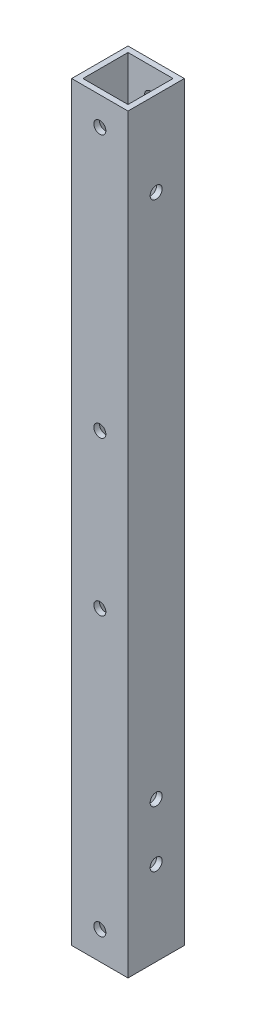
ISO-10303-21;
HEADER;
FILE_DESCRIPTION(('STEP AP214'),'2;1');
FILE_NAME('part.step','',(''),(''),'','','');
FILE_SCHEMA(('AUTOMOTIVE_DESIGN { 1 0 10303 214 1 1 1 1 }'));
ENDSEC;
DATA;
#1=APPLICATION_CONTEXT('core data for automotive mechanical design processes');
#2=APPLICATION_PROTOCOL_DEFINITION('international standard','automotive_design',2000,#1);
#3=PRODUCT_CONTEXT('',#1,'mechanical');
#4=PRODUCT('Part','Part','',(#3));
#5=PRODUCT_RELATED_PRODUCT_CATEGORY('part','',(#4));
#6=PRODUCT_DEFINITION_FORMATION('','',#4);
#7=PRODUCT_DEFINITION_CONTEXT('part definition',#1,'design');
#8=PRODUCT_DEFINITION('design','',#6,#7);
#9=PRODUCT_DEFINITION_SHAPE('','',#8);
#10=(LENGTH_UNIT() NAMED_UNIT(*) SI_UNIT(.MILLI.,.METRE.));
#11=(NAMED_UNIT(*) PLANE_ANGLE_UNIT() SI_UNIT($,.RADIAN.));
#12=(NAMED_UNIT(*) SI_UNIT($,.STERADIAN.) SOLID_ANGLE_UNIT());
#13=UNCERTAINTY_MEASURE_WITH_UNIT(LENGTH_MEASURE(1.E-05),#10,'distance_accuracy_value','');
#14=(GEOMETRIC_REPRESENTATION_CONTEXT(3) GLOBAL_UNCERTAINTY_ASSIGNED_CONTEXT((#13)) GLOBAL_UNIT_ASSIGNED_CONTEXT((#10,
#11,#12)) REPRESENTATION_CONTEXT('',''));
#15=CARTESIAN_POINT('',(0.,0.,0.));
#16=DIRECTION('',(0.,0.,1.));
#17=DIRECTION('',(1.,0.,0.));
#18=AXIS2_PLACEMENT_3D('',#15,#16,#17);
#19=CARTESIAN_POINT('',(0.,200.,0.));
#20=DIRECTION('',(0.,1.,0.));
#21=DIRECTION('',(0.,0.,1.));
#22=AXIS2_PLACEMENT_3D('',#19,#20,#21);
#23=PLANE('',#22);
#24=DIRECTION('',(0.,0.,-1.));
#25=VECTOR('',#24,1.);
#26=CARTESIAN_POINT('',(7.5,200.,-7.5));
#27=LINE('',#26,#25);
#28=CARTESIAN_POINT('',(7.5,200.,7.5));
#29=VERTEX_POINT('',#28);
#30=CARTESIAN_POINT('',(7.5,200.,-7.5));
#31=VERTEX_POINT('',#30);
#32=EDGE_CURVE('E156',#29,#31,#27,.T.);
#33=ORIENTED_EDGE('',*,*,#32,.T.);
#34=DIRECTION('',(-1.,0.,0.));
#35=VECTOR('',#34,1.);
#36=CARTESIAN_POINT('',(-7.5,200.,-7.5));
#37=LINE('',#36,#35);
#38=CARTESIAN_POINT('',(-7.5,200.,-7.5));
#39=VERTEX_POINT('',#38);
#40=EDGE_CURVE('E160',#31,#39,#37,.T.);
#41=ORIENTED_EDGE('',*,*,#40,.T.);
#42=DIRECTION('',(0.,0.,1.));
#43=VECTOR('',#42,1.);
#44=CARTESIAN_POINT('',(-7.5,200.,-7.5));
#45=LINE('',#44,#43);
#46=CARTESIAN_POINT('',(-7.5,200.,7.5));
#47=VERTEX_POINT('',#46);
#48=EDGE_CURVE('E164',#39,#47,#45,.T.);
#49=ORIENTED_EDGE('',*,*,#48,.T.);
#50=DIRECTION('',(1.,0.,0.));
#51=VECTOR('',#50,1.);
#52=CARTESIAN_POINT('',(-7.5,200.,7.5));
#53=LINE('',#52,#51);
#54=EDGE_CURVE('E167',#47,#29,#53,.T.);
#55=ORIENTED_EDGE('',*,*,#54,.T.);
#56=EDGE_LOOP('',(#33,#41,#49,#55));
#57=FACE_BOUND('',#56,.T.);
#58=DIRECTION('',(1.,0.,0.));
#59=VECTOR('',#58,1.);
#60=CARTESIAN_POINT('',(-6.,200.,6.));
#61=LINE('',#60,#59);
#62=CARTESIAN_POINT('',(-6.,200.,6.));
#63=VERTEX_POINT('',#62);
#64=CARTESIAN_POINT('',(6.,200.,6.));
#65=VERTEX_POINT('',#64);
#66=EDGE_CURVE('E115',#63,#65,#61,.T.);
#67=ORIENTED_EDGE('',*,*,#66,.F.);
#68=DIRECTION('',(0.,0.,1.));
#69=VECTOR('',#68,1.);
#70=CARTESIAN_POINT('',(-6.,200.,-6.));
#71=LINE('',#70,#69);
#72=CARTESIAN_POINT('',(-6.,200.,-6.));
#73=VERTEX_POINT('',#72);
#74=EDGE_CURVE('E106',#73,#63,#71,.T.);
#75=ORIENTED_EDGE('',*,*,#74,.F.);
#76=DIRECTION('',(-1.,0.,0.));
#77=VECTOR('',#76,1.);
#78=CARTESIAN_POINT('',(-6.,200.,-6.));
#79=LINE('',#78,#77);
#80=CARTESIAN_POINT('',(6.,200.,-6.));
#81=VERTEX_POINT('',#80);
#82=EDGE_CURVE('E132',#81,#73,#79,.T.);
#83=ORIENTED_EDGE('',*,*,#82,.F.);
#84=DIRECTION('',(0.,0.,-1.));
#85=VECTOR('',#84,1.);
#86=CARTESIAN_POINT('',(6.,200.,-6.));
#87=LINE('',#86,#85);
#88=EDGE_CURVE('E128',#65,#81,#87,.T.);
#89=ORIENTED_EDGE('',*,*,#88,.F.);
#90=EDGE_LOOP('',(#67,#75,#83,#89));
#91=FACE_BOUND('',#90,.T.);
#92=ADVANCED_FACE('F38',(#57,#91),#23,.T.);
#93=CARTESIAN_POINT('',(0.,0.,0.));
#94=DIRECTION('',(0.,1.,0.));
#95=DIRECTION('',(0.,0.,1.));
#96=AXIS2_PLACEMENT_3D('',#93,#94,#95);
#97=PLANE('',#96);
#98=DIRECTION('',(0.,0.,-1.));
#99=VECTOR('',#98,1.);
#100=CARTESIAN_POINT('',(7.5,0.,-7.5));
#101=LINE('',#100,#99);
#102=CARTESIAN_POINT('',(7.5,0.,7.5));
#103=VERTEX_POINT('',#102);
#104=CARTESIAN_POINT('',(7.5,0.,-7.5));
#105=VERTEX_POINT('',#104);
#106=EDGE_CURVE('E124',#103,#105,#101,.T.);
#107=ORIENTED_EDGE('',*,*,#106,.F.);
#108=DIRECTION('',(1.,0.,0.));
#109=VECTOR('',#108,1.);
#110=CARTESIAN_POINT('',(-7.5,0.,7.5));
#111=LINE('',#110,#109);
#112=CARTESIAN_POINT('',(-7.5,0.,7.5));
#113=VERTEX_POINT('',#112);
#114=EDGE_CURVE('E161',#113,#103,#111,.T.);
#115=ORIENTED_EDGE('',*,*,#114,.F.);
#116=DIRECTION('',(0.,0.,1.));
#117=VECTOR('',#116,1.);
#118=CARTESIAN_POINT('',(-7.5,0.,-7.5));
#119=LINE('',#118,#117);
#120=CARTESIAN_POINT('',(-7.5,0.,-7.5));
#121=VERTEX_POINT('',#120);
#122=EDGE_CURVE('E177',#121,#113,#119,.T.);
#123=ORIENTED_EDGE('',*,*,#122,.F.);
#124=DIRECTION('',(-1.,0.,0.));
#125=VECTOR('',#124,1.);
#126=CARTESIAN_POINT('',(-7.5,0.,-7.5));
#127=LINE('',#126,#125);
#128=EDGE_CURVE('E174',#105,#121,#127,.T.);
#129=ORIENTED_EDGE('',*,*,#128,.F.);
#130=EDGE_LOOP('',(#107,#115,#123,#129));
#131=FACE_BOUND('',#130,.T.);
#132=DIRECTION('',(0.,0.,1.));
#133=VECTOR('',#132,1.);
#134=CARTESIAN_POINT('',(-6.,0.,-6.));
#135=LINE('',#134,#133);
#136=CARTESIAN_POINT('',(-6.,0.,-6.));
#137=VERTEX_POINT('',#136);
#138=CARTESIAN_POINT('',(-6.,0.,6.));
#139=VERTEX_POINT('',#138);
#140=EDGE_CURVE('E64',#137,#139,#135,.T.);
#141=ORIENTED_EDGE('',*,*,#140,.T.);
#142=DIRECTION('',(1.,0.,0.));
#143=VECTOR('',#142,1.);
#144=CARTESIAN_POINT('',(-6.,0.,6.));
#145=LINE('',#144,#143);
#146=CARTESIAN_POINT('',(6.,0.,6.));
#147=VERTEX_POINT('',#146);
#148=EDGE_CURVE('E122',#139,#147,#145,.T.);
#149=ORIENTED_EDGE('',*,*,#148,.T.);
#150=DIRECTION('',(0.,0.,-1.));
#151=VECTOR('',#150,1.);
#152=CARTESIAN_POINT('',(6.,0.,-6.));
#153=LINE('',#152,#151);
#154=CARTESIAN_POINT('',(6.,0.,-6.));
#155=VERTEX_POINT('',#154);
#156=EDGE_CURVE('E143',#147,#155,#153,.T.);
#157=ORIENTED_EDGE('',*,*,#156,.T.);
#158=DIRECTION('',(-1.,0.,0.));
#159=VECTOR('',#158,1.);
#160=CARTESIAN_POINT('',(-6.,0.,-6.));
#161=LINE('',#160,#159);
#162=EDGE_CURVE('E116',#155,#137,#161,.T.);
#163=ORIENTED_EDGE('',*,*,#162,.T.);
#164=EDGE_LOOP('',(#141,#149,#157,#163));
#165=FACE_BOUND('',#164,.T.);
#166=ADVANCED_FACE('F320',(#131,#165),#97,.F.);
#167=CARTESIAN_POINT('',(7.5,200.,-7.5));
#168=DIRECTION('',(-1.,0.,0.));
#169=DIRECTION('',(0.,0.,1.));
#170=AXIS2_PLACEMENT_3D('',#167,#168,#169);
#171=PLANE('',#170);
#172=CARTESIAN_POINT('',(7.5,177.5,0.));
#173=DIRECTION('',(1.,0.,0.));
#174=DIRECTION('',(0.,0.,-1.));
#175=AXIS2_PLACEMENT_3D('',#172,#173,#174);
#176=CIRCLE('',#175,1.59999999999999);
#177=CARTESIAN_POINT('',(7.5,177.5,-1.59999999999999));
#178=VERTEX_POINT('',#177);
#179=EDGE_CURVE('E397',#178,#178,#176,.T.);
#180=ORIENTED_EDGE('',*,*,#179,.F.);
#181=EDGE_LOOP('',(#180));
#182=FACE_BOUND('',#181,.T.);
#183=CARTESIAN_POINT('',(7.5,22.5,0.));
#184=DIRECTION('',(1.,0.,0.));
#185=DIRECTION('',(0.,0.,-1.));
#186=AXIS2_PLACEMENT_3D('',#183,#184,#185);
#187=CIRCLE('',#186,1.6);
#188=CARTESIAN_POINT('',(7.5,22.5,-1.6));
#189=VERTEX_POINT('',#188);
#190=EDGE_CURVE('E407',#189,#189,#187,.T.);
#191=ORIENTED_EDGE('',*,*,#190,.F.);
#192=EDGE_LOOP('',(#191));
#193=FACE_BOUND('',#192,.T.);
#194=CARTESIAN_POINT('',(7.5,37.5,0.));
#195=DIRECTION('',(1.,0.,0.));
#196=DIRECTION('',(0.,0.,-1.));
#197=AXIS2_PLACEMENT_3D('',#194,#195,#196);
#198=CIRCLE('',#197,1.6);
#199=CARTESIAN_POINT('',(7.5,37.5,-1.6));
#200=VERTEX_POINT('',#199);
#201=EDGE_CURVE('E232',#200,#200,#198,.T.);
#202=ORIENTED_EDGE('',*,*,#201,.F.);
#203=EDGE_LOOP('',(#202));
#204=FACE_BOUND('',#203,.T.);
#205=ORIENTED_EDGE('',*,*,#106,.T.);
#206=DIRECTION('',(0.,-1.,0.));
#207=VECTOR('',#206,1.);
#208=CARTESIAN_POINT('',(7.5,200.,-7.5));
#209=LINE('',#208,#207);
#210=EDGE_CURVE('E11',#31,#105,#209,.T.);
#211=ORIENTED_EDGE('',*,*,#210,.F.);
#212=ORIENTED_EDGE('',*,*,#32,.F.);
#213=DIRECTION('',(0.,-1.,0.));
#214=VECTOR('',#213,1.);
#215=CARTESIAN_POINT('',(7.5,200.,7.5));
#216=LINE('',#215,#214);
#217=EDGE_CURVE('E170',#29,#103,#216,.T.);
#218=ORIENTED_EDGE('',*,*,#217,.T.);
#219=EDGE_LOOP('',(#205,#211,#212,#218));
#220=FACE_BOUND('',#219,.T.);
#221=ADVANCED_FACE('F40',(#182,#193,#204,#220),#171,.F.);
#222=CARTESIAN_POINT('',(-7.5,200.,-7.5));
#223=DIRECTION('',(0.,0.,1.));
#224=DIRECTION('',(1.,0.,0.));
#225=AXIS2_PLACEMENT_3D('',#222,#223,#224);
#226=PLANE('',#225);
#227=CARTESIAN_POINT('',(0.,192.5,-7.5));
#228=DIRECTION('',(0.,0.,1.));
#229=DIRECTION('',(1.,0.,0.));
#230=AXIS2_PLACEMENT_3D('',#227,#228,#229);
#231=CIRCLE('',#230,1.59999999999999);
#232=CARTESIAN_POINT('',(1.59999999999999,192.5,-7.5));
#233=VERTEX_POINT('',#232);
#234=EDGE_CURVE('E197',#233,#233,#231,.T.);
#235=ORIENTED_EDGE('',*,*,#234,.T.);
#236=EDGE_LOOP('',(#235));
#237=FACE_BOUND('',#236,.T.);
#238=CARTESIAN_POINT('',(0.,81.5,-7.5));
#239=DIRECTION('',(0.,0.,1.));
#240=DIRECTION('',(1.,0.,0.));
#241=AXIS2_PLACEMENT_3D('',#238,#239,#240);
#242=CIRCLE('',#241,1.6);
#243=CARTESIAN_POINT('',(1.6,81.5,-7.5));
#244=VERTEX_POINT('',#243);
#245=EDGE_CURVE('E248',#244,#244,#242,.T.);
#246=ORIENTED_EDGE('',*,*,#245,.T.);
#247=EDGE_LOOP('',(#246));
#248=FACE_BOUND('',#247,.T.);
#249=CARTESIAN_POINT('',(0.,122.5,-7.5));
#250=DIRECTION('',(0.,0.,1.));
#251=DIRECTION('',(1.,0.,0.));
#252=AXIS2_PLACEMENT_3D('',#249,#250,#251);
#253=CIRCLE('',#252,1.6);
#254=CARTESIAN_POINT('',(1.6,122.5,-7.5));
#255=VERTEX_POINT('',#254);
#256=EDGE_CURVE('E263',#255,#255,#253,.T.);
#257=ORIENTED_EDGE('',*,*,#256,.T.);
#258=EDGE_LOOP('',(#257));
#259=FACE_BOUND('',#258,.T.);
#260=CARTESIAN_POINT('',(0.,7.5,-7.5));
#261=DIRECTION('',(0.,0.,1.));
#262=DIRECTION('',(1.,0.,0.));
#263=AXIS2_PLACEMENT_3D('',#260,#261,#262);
#264=CIRCLE('',#263,1.6);
#265=CARTESIAN_POINT('',(1.6,7.5,-7.5));
#266=VERTEX_POINT('',#265);
#267=EDGE_CURVE('E247',#266,#266,#264,.T.);
#268=ORIENTED_EDGE('',*,*,#267,.T.);
#269=EDGE_LOOP('',(#268));
#270=FACE_BOUND('',#269,.T.);
#271=ORIENTED_EDGE('',*,*,#128,.T.);
#272=DIRECTION('',(0.,-1.,0.));
#273=VECTOR('',#272,1.);
#274=CARTESIAN_POINT('',(-7.5,200.,-7.5));
#275=LINE('',#274,#273);
#276=EDGE_CURVE('E48',#39,#121,#275,.T.);
#277=ORIENTED_EDGE('',*,*,#276,.F.);
#278=ORIENTED_EDGE('',*,*,#40,.F.);
#279=ORIENTED_EDGE('',*,*,#210,.T.);
#280=EDGE_LOOP('',(#271,#277,#278,#279));
#281=FACE_BOUND('',#280,.T.);
#282=ADVANCED_FACE('F324',(#237,#248,#259,#270,#281),#226,.F.);
#283=CARTESIAN_POINT('',(-7.5,200.,-7.5));
#284=DIRECTION('',(1.,0.,0.));
#285=DIRECTION('',(0.,0.,-1.));
#286=AXIS2_PLACEMENT_3D('',#283,#284,#285);
#287=PLANE('',#286);
#288=CARTESIAN_POINT('',(-7.5,177.5,0.));
#289=DIRECTION('',(1.,0.,0.));
#290=DIRECTION('',(0.,0.,-1.));
#291=AXIS2_PLACEMENT_3D('',#288,#289,#290);
#292=CIRCLE('',#291,1.59999999999999);
#293=CARTESIAN_POINT('',(-7.5,177.5,-1.59999999999999));
#294=VERTEX_POINT('',#293);
#295=EDGE_CURVE('E216',#294,#294,#292,.T.);
#296=ORIENTED_EDGE('',*,*,#295,.T.);
#297=EDGE_LOOP('',(#296));
#298=FACE_BOUND('',#297,.T.);
#299=CARTESIAN_POINT('',(-7.5,22.5,0.));
#300=DIRECTION('',(1.,0.,0.));
#301=DIRECTION('',(0.,0.,-1.));
#302=AXIS2_PLACEMENT_3D('',#299,#300,#301);
#303=CIRCLE('',#302,1.6);
#304=CARTESIAN_POINT('',(-7.5,22.5,-1.6));
#305=VERTEX_POINT('',#304);
#306=EDGE_CURVE('E401',#305,#305,#303,.T.);
#307=ORIENTED_EDGE('',*,*,#306,.T.);
#308=EDGE_LOOP('',(#307));
#309=FACE_BOUND('',#308,.T.);
#310=CARTESIAN_POINT('',(-7.5,37.5,0.));
#311=DIRECTION('',(1.,0.,0.));
#312=DIRECTION('',(0.,0.,-1.));
#313=AXIS2_PLACEMENT_3D('',#310,#311,#312);
#314=CIRCLE('',#313,1.6);
#315=CARTESIAN_POINT('',(-7.5,37.5,-1.6));
#316=VERTEX_POINT('',#315);
#317=EDGE_CURVE('E410',#316,#316,#314,.T.);
#318=ORIENTED_EDGE('',*,*,#317,.T.);
#319=EDGE_LOOP('',(#318));
#320=FACE_BOUND('',#319,.T.);
#321=ORIENTED_EDGE('',*,*,#122,.T.);
#322=DIRECTION('',(0.,-1.,0.));
#323=VECTOR('',#322,1.);
#324=CARTESIAN_POINT('',(-7.5,200.,7.5));
#325=LINE('',#324,#323);
#326=EDGE_CURVE('E185',#47,#113,#325,.T.);
#327=ORIENTED_EDGE('',*,*,#326,.F.);
#328=ORIENTED_EDGE('',*,*,#48,.F.);
#329=ORIENTED_EDGE('',*,*,#276,.T.);
#330=EDGE_LOOP('',(#321,#327,#328,#329));
#331=FACE_BOUND('',#330,.T.);
#332=ADVANCED_FACE('F307',(#298,#309,#320,#331),#287,.F.);
#333=CARTESIAN_POINT('',(-7.5,200.,7.5));
#334=DIRECTION('',(0.,0.,-1.));
#335=DIRECTION('',(-1.,0.,0.));
#336=AXIS2_PLACEMENT_3D('',#333,#334,#335);
#337=PLANE('',#336);
#338=CARTESIAN_POINT('',(0.,192.5,7.5));
#339=DIRECTION('',(0.,0.,1.));
#340=DIRECTION('',(1.,0.,0.));
#341=AXIS2_PLACEMENT_3D('',#338,#339,#340);
#342=CIRCLE('',#341,1.59999999999999);
#343=CARTESIAN_POINT('',(1.59999999999999,192.5,7.5));
#344=VERTEX_POINT('',#343);
#345=EDGE_CURVE('E243',#344,#344,#342,.T.);
#346=ORIENTED_EDGE('',*,*,#345,.F.);
#347=EDGE_LOOP('',(#346));
#348=FACE_BOUND('',#347,.T.);
#349=CARTESIAN_POINT('',(0.,81.5,7.5));
#350=DIRECTION('',(0.,0.,1.));
#351=DIRECTION('',(1.,0.,0.));
#352=AXIS2_PLACEMENT_3D('',#349,#350,#351);
#353=CIRCLE('',#352,1.6);
#354=CARTESIAN_POINT('',(1.6,81.5,7.5));
#355=VERTEX_POINT('',#354);
#356=EDGE_CURVE('E239',#355,#355,#353,.T.);
#357=ORIENTED_EDGE('',*,*,#356,.F.);
#358=EDGE_LOOP('',(#357));
#359=FACE_BOUND('',#358,.T.);
#360=CARTESIAN_POINT('',(0.,122.5,7.5));
#361=DIRECTION('',(0.,0.,1.));
#362=DIRECTION('',(1.,0.,0.));
#363=AXIS2_PLACEMENT_3D('',#360,#361,#362);
#364=CIRCLE('',#363,1.6);
#365=CARTESIAN_POINT('',(1.6,122.5,7.5));
#366=VERTEX_POINT('',#365);
#367=EDGE_CURVE('E252',#366,#366,#364,.T.);
#368=ORIENTED_EDGE('',*,*,#367,.F.);
#369=EDGE_LOOP('',(#368));
#370=FACE_BOUND('',#369,.T.);
#371=CARTESIAN_POINT('',(0.,7.5,7.5));
#372=DIRECTION('',(0.,0.,1.));
#373=DIRECTION('',(1.,0.,0.));
#374=AXIS2_PLACEMENT_3D('',#371,#372,#373);
#375=CIRCLE('',#374,1.6);
#376=CARTESIAN_POINT('',(1.6,7.5,7.5));
#377=VERTEX_POINT('',#376);
#378=EDGE_CURVE('E259',#377,#377,#375,.T.);
#379=ORIENTED_EDGE('',*,*,#378,.F.);
#380=EDGE_LOOP('',(#379));
#381=FACE_BOUND('',#380,.T.);
#382=ORIENTED_EDGE('',*,*,#114,.T.);
#383=ORIENTED_EDGE('',*,*,#217,.F.);
#384=ORIENTED_EDGE('',*,*,#54,.F.);
#385=ORIENTED_EDGE('',*,*,#326,.T.);
#386=EDGE_LOOP('',(#382,#383,#384,#385));
#387=FACE_BOUND('',#386,.T.);
#388=ADVANCED_FACE('F304',(#348,#359,#370,#381,#387),#337,.F.);
#389=CARTESIAN_POINT('',(-6.,200.,-6.));
#390=DIRECTION('',(1.,0.,0.));
#391=DIRECTION('',(0.,0.,-1.));
#392=AXIS2_PLACEMENT_3D('',#389,#390,#391);
#393=PLANE('',#392);
#394=CARTESIAN_POINT('',(-6.,177.5,0.));
#395=DIRECTION('',(1.,0.,0.));
#396=DIRECTION('',(0.,0.,-1.));
#397=AXIS2_PLACEMENT_3D('',#394,#395,#396);
#398=CIRCLE('',#397,1.59999999999999);
#399=CARTESIAN_POINT('',(-6.,177.5,-1.59999999999999));
#400=VERTEX_POINT('',#399);
#401=EDGE_CURVE('E235',#400,#400,#398,.T.);
#402=ORIENTED_EDGE('',*,*,#401,.F.);
#403=EDGE_LOOP('',(#402));
#404=FACE_BOUND('',#403,.T.);
#405=CARTESIAN_POINT('',(-6.,22.5,0.));
#406=DIRECTION('',(1.,0.,0.));
#407=DIRECTION('',(0.,0.,-1.));
#408=AXIS2_PLACEMENT_3D('',#405,#406,#407);
#409=CIRCLE('',#408,1.6);
#410=CARTESIAN_POINT('',(-6.,22.5,-1.6));
#411=VERTEX_POINT('',#410);
#412=EDGE_CURVE('E220',#411,#411,#409,.T.);
#413=ORIENTED_EDGE('',*,*,#412,.F.);
#414=EDGE_LOOP('',(#413));
#415=FACE_BOUND('',#414,.T.);
#416=CARTESIAN_POINT('',(-6.,37.5,0.));
#417=DIRECTION('',(1.,0.,0.));
#418=DIRECTION('',(0.,0.,-1.));
#419=AXIS2_PLACEMENT_3D('',#416,#417,#418);
#420=CIRCLE('',#419,1.6);
#421=CARTESIAN_POINT('',(-6.,37.5,-1.6));
#422=VERTEX_POINT('',#421);
#423=EDGE_CURVE('E215',#422,#422,#420,.T.);
#424=ORIENTED_EDGE('',*,*,#423,.F.);
#425=EDGE_LOOP('',(#424));
#426=FACE_BOUND('',#425,.T.);
#427=ORIENTED_EDGE('',*,*,#140,.F.);
#428=DIRECTION('',(0.,-1.,0.));
#429=VECTOR('',#428,1.);
#430=CARTESIAN_POINT('',(-6.,200.,-6.));
#431=LINE('',#430,#429);
#432=EDGE_CURVE('E110',#73,#137,#431,.T.);
#433=ORIENTED_EDGE('',*,*,#432,.F.);
#434=ORIENTED_EDGE('',*,*,#74,.T.);
#435=DIRECTION('',(0.,-1.,0.));
#436=VECTOR('',#435,1.);
#437=CARTESIAN_POINT('',(-6.,200.,6.));
#438=LINE('',#437,#436);
#439=EDGE_CURVE('E109',#63,#139,#438,.T.);
#440=ORIENTED_EDGE('',*,*,#439,.T.);
#441=EDGE_LOOP('',(#427,#433,#434,#440));
#442=FACE_BOUND('',#441,.T.);
#443=ADVANCED_FACE('F108',(#404,#415,#426,#442),#393,.T.);
#444=CARTESIAN_POINT('',(-6.,200.,6.));
#445=DIRECTION('',(0.,0.,-1.));
#446=DIRECTION('',(-1.,0.,0.));
#447=AXIS2_PLACEMENT_3D('',#444,#445,#446);
#448=PLANE('',#447);
#449=CARTESIAN_POINT('',(0.,192.5,6.));
#450=DIRECTION('',(0.,0.,-1.));
#451=DIRECTION('',(-1.,0.,0.));
#452=AXIS2_PLACEMENT_3D('',#449,#450,#451);
#453=CIRCLE('',#452,1.59999999999999);
#454=CARTESIAN_POINT('',(-1.59999999999999,192.5,6.));
#455=VERTEX_POINT('',#454);
#456=EDGE_CURVE('E140',#455,#455,#453,.T.);
#457=ORIENTED_EDGE('',*,*,#456,.F.);
#458=EDGE_LOOP('',(#457));
#459=FACE_BOUND('',#458,.T.);
#460=CARTESIAN_POINT('',(0.,81.5,6.));
#461=DIRECTION('',(0.,0.,-1.));
#462=DIRECTION('',(-1.,0.,0.));
#463=AXIS2_PLACEMENT_3D('',#460,#461,#462);
#464=CIRCLE('',#463,1.6);
#465=CARTESIAN_POINT('',(-1.6,81.5,6.));
#466=VERTEX_POINT('',#465);
#467=EDGE_CURVE('E207',#466,#466,#464,.T.);
#468=ORIENTED_EDGE('',*,*,#467,.F.);
#469=EDGE_LOOP('',(#468));
#470=FACE_BOUND('',#469,.T.);
#471=CARTESIAN_POINT('',(0.,122.5,6.));
#472=DIRECTION('',(0.,0.,-1.));
#473=DIRECTION('',(-1.,0.,0.));
#474=AXIS2_PLACEMENT_3D('',#471,#472,#473);
#475=CIRCLE('',#474,1.6);
#476=CARTESIAN_POINT('',(-1.6,122.5,6.));
#477=VERTEX_POINT('',#476);
#478=EDGE_CURVE('E202',#477,#477,#475,.T.);
#479=ORIENTED_EDGE('',*,*,#478,.F.);
#480=EDGE_LOOP('',(#479));
#481=FACE_BOUND('',#480,.T.);
#482=CARTESIAN_POINT('',(0.,7.5,6.));
#483=DIRECTION('',(0.,0.,-1.));
#484=DIRECTION('',(-1.,0.,0.));
#485=AXIS2_PLACEMENT_3D('',#482,#483,#484);
#486=CIRCLE('',#485,1.6);
#487=CARTESIAN_POINT('',(-1.6,7.5,6.));
#488=VERTEX_POINT('',#487);
#489=EDGE_CURVE('E196',#488,#488,#486,.T.);
#490=ORIENTED_EDGE('',*,*,#489,.F.);
#491=EDGE_LOOP('',(#490));
#492=FACE_BOUND('',#491,.T.);
#493=ORIENTED_EDGE('',*,*,#148,.F.);
#494=ORIENTED_EDGE('',*,*,#439,.F.);
#495=ORIENTED_EDGE('',*,*,#66,.T.);
#496=DIRECTION('',(0.,-1.,0.));
#497=VECTOR('',#496,1.);
#498=CARTESIAN_POINT('',(6.,200.,6.));
#499=LINE('',#498,#497);
#500=EDGE_CURVE('E125',#65,#147,#499,.T.);
#501=ORIENTED_EDGE('',*,*,#500,.T.);
#502=EDGE_LOOP('',(#493,#494,#495,#501));
#503=FACE_BOUND('',#502,.T.);
#504=ADVANCED_FACE('F119',(#459,#470,#481,#492,#503),#448,.T.);
#505=CARTESIAN_POINT('',(6.,200.,-6.));
#506=DIRECTION('',(-1.,0.,0.));
#507=DIRECTION('',(0.,0.,1.));
#508=AXIS2_PLACEMENT_3D('',#505,#506,#507);
#509=PLANE('',#508);
#510=CARTESIAN_POINT('',(6.,177.5,0.));
#511=DIRECTION('',(-1.,0.,0.));
#512=DIRECTION('',(0.,0.,1.));
#513=AXIS2_PLACEMENT_3D('',#510,#511,#512);
#514=CIRCLE('',#513,1.59999999999999);
#515=CARTESIAN_POINT('',(6.,177.5,1.59999999999999));
#516=VERTEX_POINT('',#515);
#517=EDGE_CURVE('E42',#516,#516,#514,.T.);
#518=ORIENTED_EDGE('',*,*,#517,.F.);
#519=EDGE_LOOP('',(#518));
#520=FACE_BOUND('',#519,.T.);
#521=CARTESIAN_POINT('',(6.,22.5,0.));
#522=DIRECTION('',(-1.,0.,0.));
#523=DIRECTION('',(0.,0.,1.));
#524=AXIS2_PLACEMENT_3D('',#521,#522,#523);
#525=CIRCLE('',#524,1.6);
#526=CARTESIAN_POINT('',(6.,22.5,1.6));
#527=VERTEX_POINT('',#526);
#528=EDGE_CURVE('E217',#527,#527,#525,.T.);
#529=ORIENTED_EDGE('',*,*,#528,.F.);
#530=EDGE_LOOP('',(#529));
#531=FACE_BOUND('',#530,.T.);
#532=CARTESIAN_POINT('',(6.,37.5,0.));
#533=DIRECTION('',(-1.,0.,0.));
#534=DIRECTION('',(0.,0.,1.));
#535=AXIS2_PLACEMENT_3D('',#532,#533,#534);
#536=CIRCLE('',#535,1.6);
#537=CARTESIAN_POINT('',(6.,37.5,1.6));
#538=VERTEX_POINT('',#537);
#539=EDGE_CURVE('E212',#538,#538,#536,.T.);
#540=ORIENTED_EDGE('',*,*,#539,.F.);
#541=EDGE_LOOP('',(#540));
#542=FACE_BOUND('',#541,.T.);
#543=ORIENTED_EDGE('',*,*,#156,.F.);
#544=ORIENTED_EDGE('',*,*,#500,.F.);
#545=ORIENTED_EDGE('',*,*,#88,.T.);
#546=DIRECTION('',(0.,-1.,0.));
#547=VECTOR('',#546,1.);
#548=CARTESIAN_POINT('',(6.,200.,-6.));
#549=LINE('',#548,#547);
#550=EDGE_CURVE('E56',#81,#155,#549,.T.);
#551=ORIENTED_EDGE('',*,*,#550,.T.);
#552=EDGE_LOOP('',(#543,#544,#545,#551));
#553=FACE_BOUND('',#552,.T.);
#554=ADVANCED_FACE('F287',(#520,#531,#542,#553),#509,.T.);
#555=CARTESIAN_POINT('',(-6.,200.,-6.));
#556=DIRECTION('',(0.,0.,1.));
#557=DIRECTION('',(1.,0.,0.));
#558=AXIS2_PLACEMENT_3D('',#555,#556,#557);
#559=PLANE('',#558);
#560=CARTESIAN_POINT('',(0.,192.5,-6.));
#561=DIRECTION('',(0.,0.,1.));
#562=DIRECTION('',(1.,0.,0.));
#563=AXIS2_PLACEMENT_3D('',#560,#561,#562);
#564=CIRCLE('',#563,1.59999999999999);
#565=CARTESIAN_POINT('',(1.59999999999999,192.5,-6.));
#566=VERTEX_POINT('',#565);
#567=EDGE_CURVE('E208',#566,#566,#564,.T.);
#568=ORIENTED_EDGE('',*,*,#567,.F.);
#569=EDGE_LOOP('',(#568));
#570=FACE_BOUND('',#569,.T.);
#571=CARTESIAN_POINT('',(0.,81.5,-6.));
#572=DIRECTION('',(0.,0.,1.));
#573=DIRECTION('',(1.,0.,0.));
#574=AXIS2_PLACEMENT_3D('',#571,#572,#573);
#575=CIRCLE('',#574,1.6);
#576=CARTESIAN_POINT('',(1.6,81.5,-6.));
#577=VERTEX_POINT('',#576);
#578=EDGE_CURVE('E203',#577,#577,#575,.T.);
#579=ORIENTED_EDGE('',*,*,#578,.F.);
#580=EDGE_LOOP('',(#579));
#581=FACE_BOUND('',#580,.T.);
#582=CARTESIAN_POINT('',(0.,122.5,-6.));
#583=DIRECTION('',(0.,0.,1.));
#584=DIRECTION('',(1.,0.,0.));
#585=AXIS2_PLACEMENT_3D('',#582,#583,#584);
#586=CIRCLE('',#585,1.6);
#587=CARTESIAN_POINT('',(1.6,122.5,-6.));
#588=VERTEX_POINT('',#587);
#589=EDGE_CURVE('E198',#588,#588,#586,.T.);
#590=ORIENTED_EDGE('',*,*,#589,.F.);
#591=EDGE_LOOP('',(#590));
#592=FACE_BOUND('',#591,.T.);
#593=CARTESIAN_POINT('',(0.,7.5,-6.));
#594=DIRECTION('',(0.,0.,1.));
#595=DIRECTION('',(1.,0.,0.));
#596=AXIS2_PLACEMENT_3D('',#593,#594,#595);
#597=CIRCLE('',#596,1.6);
#598=CARTESIAN_POINT('',(1.6,7.5,-6.));
#599=VERTEX_POINT('',#598);
#600=EDGE_CURVE('E192',#599,#599,#597,.T.);
#601=ORIENTED_EDGE('',*,*,#600,.F.);
#602=EDGE_LOOP('',(#601));
#603=FACE_BOUND('',#602,.T.);
#604=ORIENTED_EDGE('',*,*,#162,.F.);
#605=ORIENTED_EDGE('',*,*,#550,.F.);
#606=ORIENTED_EDGE('',*,*,#82,.T.);
#607=ORIENTED_EDGE('',*,*,#432,.T.);
#608=EDGE_LOOP('',(#604,#605,#606,#607));
#609=FACE_BOUND('',#608,.T.);
#610=ADVANCED_FACE('F350',(#570,#581,#592,#603,#609),#559,.T.);
#611=CARTESIAN_POINT('',(0.,7.5,-7.5));
#612=DIRECTION('',(0.,0.,1.));
#613=DIRECTION('',(1.,0.,0.));
#614=AXIS2_PLACEMENT_3D('',#611,#612,#613);
#615=CYLINDRICAL_SURFACE('',#614,1.6);
#616=ORIENTED_EDGE('',*,*,#600,.T.);
#617=EDGE_LOOP('',(#616));
#618=FACE_BOUND('',#617,.T.);
#619=ORIENTED_EDGE('',*,*,#267,.F.);
#620=EDGE_LOOP('',(#619));
#621=FACE_BOUND('',#620,.T.);
#622=ADVANCED_FACE('F301',(#618,#621),#615,.F.);
#623=CARTESIAN_POINT('',(0.,122.5,-7.5));
#624=DIRECTION('',(0.,0.,1.));
#625=DIRECTION('',(1.,0.,0.));
#626=AXIS2_PLACEMENT_3D('',#623,#624,#625);
#627=CYLINDRICAL_SURFACE('',#626,1.6);
#628=ORIENTED_EDGE('',*,*,#589,.T.);
#629=EDGE_LOOP('',(#628));
#630=FACE_BOUND('',#629,.T.);
#631=ORIENTED_EDGE('',*,*,#256,.F.);
#632=EDGE_LOOP('',(#631));
#633=FACE_BOUND('',#632,.T.);
#634=ADVANCED_FACE('F355',(#630,#633),#627,.F.);
#635=CARTESIAN_POINT('',(0.,81.5,-7.5));
#636=DIRECTION('',(0.,0.,1.));
#637=DIRECTION('',(1.,0.,0.));
#638=AXIS2_PLACEMENT_3D('',#635,#636,#637);
#639=CYLINDRICAL_SURFACE('',#638,1.6);
#640=ORIENTED_EDGE('',*,*,#578,.T.);
#641=EDGE_LOOP('',(#640));
#642=FACE_BOUND('',#641,.T.);
#643=ORIENTED_EDGE('',*,*,#245,.F.);
#644=EDGE_LOOP('',(#643));
#645=FACE_BOUND('',#644,.T.);
#646=ADVANCED_FACE('F357',(#642,#645),#639,.F.);
#647=CARTESIAN_POINT('',(0.,192.5,-7.5));
#648=DIRECTION('',(0.,0.,1.));
#649=DIRECTION('',(1.,0.,0.));
#650=AXIS2_PLACEMENT_3D('',#647,#648,#649);
#651=CYLINDRICAL_SURFACE('',#650,1.59999999999999);
#652=ORIENTED_EDGE('',*,*,#567,.T.);
#653=EDGE_LOOP('',(#652));
#654=FACE_BOUND('',#653,.T.);
#655=ORIENTED_EDGE('',*,*,#234,.F.);
#656=EDGE_LOOP('',(#655));
#657=FACE_BOUND('',#656,.T.);
#658=ADVANCED_FACE('F299',(#654,#657),#651,.F.);
#659=ORIENTED_EDGE('',*,*,#489,.T.);
#660=EDGE_LOOP('',(#659));
#661=FACE_BOUND('',#660,.T.);
#662=ORIENTED_EDGE('',*,*,#378,.T.);
#663=EDGE_LOOP('',(#662));
#664=FACE_BOUND('',#663,.T.);
#665=ADVANCED_FACE('F295',(#661,#664),#615,.F.);
#666=ORIENTED_EDGE('',*,*,#478,.T.);
#667=EDGE_LOOP('',(#666));
#668=FACE_BOUND('',#667,.T.);
#669=ORIENTED_EDGE('',*,*,#367,.T.);
#670=EDGE_LOOP('',(#669));
#671=FACE_BOUND('',#670,.T.);
#672=ADVANCED_FACE('F298',(#668,#671),#627,.F.);
#673=ORIENTED_EDGE('',*,*,#467,.T.);
#674=EDGE_LOOP('',(#673));
#675=FACE_BOUND('',#674,.T.);
#676=ORIENTED_EDGE('',*,*,#356,.T.);
#677=EDGE_LOOP('',(#676));
#678=FACE_BOUND('',#677,.T.);
#679=ADVANCED_FACE('F365',(#675,#678),#639,.F.);
#680=ORIENTED_EDGE('',*,*,#456,.T.);
#681=EDGE_LOOP('',(#680));
#682=FACE_BOUND('',#681,.T.);
#683=ORIENTED_EDGE('',*,*,#345,.T.);
#684=EDGE_LOOP('',(#683));
#685=FACE_BOUND('',#684,.T.);
#686=ADVANCED_FACE('F282',(#682,#685),#651,.F.);
#687=CARTESIAN_POINT('',(-7.5,37.5,0.));
#688=DIRECTION('',(1.,0.,0.));
#689=DIRECTION('',(0.,0.,-1.));
#690=AXIS2_PLACEMENT_3D('',#687,#688,#689);
#691=CYLINDRICAL_SURFACE('',#690,1.6);
#692=ORIENTED_EDGE('',*,*,#539,.T.);
#693=EDGE_LOOP('',(#692));
#694=FACE_BOUND('',#693,.T.);
#695=ORIENTED_EDGE('',*,*,#201,.T.);
#696=EDGE_LOOP('',(#695));
#697=FACE_BOUND('',#696,.T.);
#698=ADVANCED_FACE('F369',(#694,#697),#691,.F.);
#699=CARTESIAN_POINT('',(-7.5,22.5,0.));
#700=DIRECTION('',(1.,0.,0.));
#701=DIRECTION('',(0.,0.,-1.));
#702=AXIS2_PLACEMENT_3D('',#699,#700,#701);
#703=CYLINDRICAL_SURFACE('',#702,1.6);
#704=ORIENTED_EDGE('',*,*,#528,.T.);
#705=EDGE_LOOP('',(#704));
#706=FACE_BOUND('',#705,.T.);
#707=ORIENTED_EDGE('',*,*,#190,.T.);
#708=EDGE_LOOP('',(#707));
#709=FACE_BOUND('',#708,.T.);
#710=ADVANCED_FACE('F372',(#706,#709),#703,.F.);
#711=CARTESIAN_POINT('',(-7.5,177.5,0.));
#712=DIRECTION('',(1.,0.,0.));
#713=DIRECTION('',(0.,0.,-1.));
#714=AXIS2_PLACEMENT_3D('',#711,#712,#713);
#715=CYLINDRICAL_SURFACE('',#714,1.59999999999999);
#716=ORIENTED_EDGE('',*,*,#517,.T.);
#717=EDGE_LOOP('',(#716));
#718=FACE_BOUND('',#717,.T.);
#719=ORIENTED_EDGE('',*,*,#179,.T.);
#720=EDGE_LOOP('',(#719));
#721=FACE_BOUND('',#720,.T.);
#722=ADVANCED_FACE('F377',(#718,#721),#715,.F.);
#723=ORIENTED_EDGE('',*,*,#423,.T.);
#724=EDGE_LOOP('',(#723));
#725=FACE_BOUND('',#724,.T.);
#726=ORIENTED_EDGE('',*,*,#317,.F.);
#727=EDGE_LOOP('',(#726));
#728=FACE_BOUND('',#727,.T.);
#729=ADVANCED_FACE('F374',(#725,#728),#691,.F.);
#730=ORIENTED_EDGE('',*,*,#412,.T.);
#731=EDGE_LOOP('',(#730));
#732=FACE_BOUND('',#731,.T.);
#733=ORIENTED_EDGE('',*,*,#306,.F.);
#734=EDGE_LOOP('',(#733));
#735=FACE_BOUND('',#734,.T.);
#736=ADVANCED_FACE('F378',(#732,#735),#703,.F.);
#737=ORIENTED_EDGE('',*,*,#401,.T.);
#738=EDGE_LOOP('',(#737));
#739=FACE_BOUND('',#738,.T.);
#740=ORIENTED_EDGE('',*,*,#295,.F.);
#741=EDGE_LOOP('',(#740));
#742=FACE_BOUND('',#741,.T.);
#743=ADVANCED_FACE('F381',(#739,#742),#715,.F.);
#744=CLOSED_SHELL('',(#92,#166,#221,#282,#332,#388,#443,#504,#554,#610,#622,#634,#646,#658,#665,
#672,#679,#686,#698,#710,#722,#729,#736,#743));
#745=MANIFOLD_SOLID_BREP('B2',#744);
#746=ADVANCED_BREP_SHAPE_REPRESENTATION('',(#18,#745),#14);
#747=SHAPE_DEFINITION_REPRESENTATION(#9,#746);
ENDSEC;
END-ISO-10303-21;
